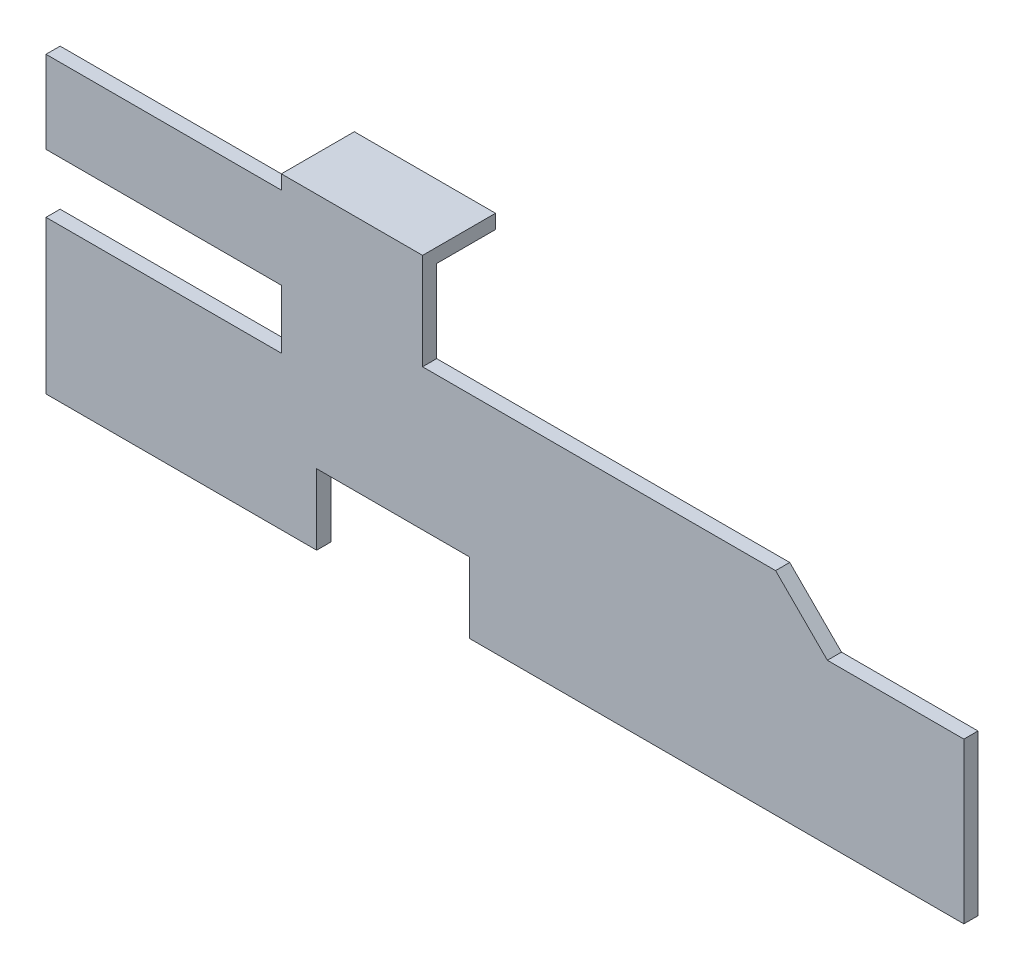
ISO-10303-21;
HEADER;
FILE_DESCRIPTION(('STEP AP214'),'2;1');
FILE_NAME('part.step','',(''),(''),'','','');
FILE_SCHEMA(('AUTOMOTIVE_DESIGN { 1 0 10303 214 1 1 1 1 }'));
ENDSEC;
DATA;
#1=APPLICATION_CONTEXT('core data for automotive mechanical design processes');
#2=APPLICATION_PROTOCOL_DEFINITION('international standard','automotive_design',2000,#1);
#3=PRODUCT_CONTEXT('',#1,'mechanical');
#4=PRODUCT('Part','Part','',(#3));
#5=PRODUCT_RELATED_PRODUCT_CATEGORY('part','',(#4));
#6=PRODUCT_DEFINITION_FORMATION('','',#4);
#7=PRODUCT_DEFINITION_CONTEXT('part definition',#1,'design');
#8=PRODUCT_DEFINITION('design','',#6,#7);
#9=PRODUCT_DEFINITION_SHAPE('','',#8);
#10=(LENGTH_UNIT() NAMED_UNIT(*) SI_UNIT(.MILLI.,.METRE.));
#11=(NAMED_UNIT(*) PLANE_ANGLE_UNIT() SI_UNIT($,.RADIAN.));
#12=(NAMED_UNIT(*) SI_UNIT($,.STERADIAN.) SOLID_ANGLE_UNIT());
#13=UNCERTAINTY_MEASURE_WITH_UNIT(LENGTH_MEASURE(1.E-05),#10,'distance_accuracy_value','');
#14=(GEOMETRIC_REPRESENTATION_CONTEXT(3) GLOBAL_UNCERTAINTY_ASSIGNED_CONTEXT((#13)) GLOBAL_UNIT_ASSIGNED_CONTEXT((#10,
#11,#12)) REPRESENTATION_CONTEXT('',''));
#15=CARTESIAN_POINT('',(0.,0.,0.));
#16=DIRECTION('',(0.,0.,1.));
#17=DIRECTION('',(1.,0.,0.));
#18=AXIS2_PLACEMENT_3D('',#15,#16,#17);
#19=CARTESIAN_POINT('',(0.,0.,0.));
#20=DIRECTION('',(0.,0.,1.));
#21=DIRECTION('',(1.,0.,0.));
#22=AXIS2_PLACEMENT_3D('',#19,#20,#21);
#23=PLANE('',#22);
#24=DIRECTION('',(-1.,0.,0.));
#25=VECTOR('',#24,1.);
#26=CARTESIAN_POINT('',(10.,12.5,0.));
#27=LINE('',#26,#25);
#28=CARTESIAN_POINT('',(16.,12.5,0.));
#29=VERTEX_POINT('',#28);
#30=CARTESIAN_POINT('',(10.,12.5,0.));
#31=VERTEX_POINT('',#30);
#32=EDGE_CURVE('E52',#29,#31,#27,.T.);
#33=ORIENTED_EDGE('',*,*,#32,.F.);
#34=DIRECTION('',(0.,1.,0.));
#35=VECTOR('',#34,1.);
#36=CARTESIAN_POINT('',(16.,8.99999999999999,0.));
#37=LINE('',#36,#35);
#38=CARTESIAN_POINT('',(16.,8.99999999999999,0.));
#39=VERTEX_POINT('',#38);
#40=EDGE_CURVE('E216',#39,#29,#37,.T.);
#41=ORIENTED_EDGE('',*,*,#40,.F.);
#42=DIRECTION('',(-1.,0.,0.));
#43=VECTOR('',#42,1.);
#44=CARTESIAN_POINT('',(31.,9.,0.));
#45=LINE('',#44,#43);
#46=CARTESIAN_POINT('',(31.,9.,0.));
#47=VERTEX_POINT('',#46);
#48=EDGE_CURVE('E214',#47,#39,#45,.T.);
#49=ORIENTED_EDGE('',*,*,#48,.F.);
#50=DIRECTION('',(-0.707106781186548,0.707106781186547,0.));
#51=VECTOR('',#50,1.);
#52=CARTESIAN_POINT('',(33.2,6.8,0.));
#53=LINE('',#52,#51);
#54=CARTESIAN_POINT('',(33.2,6.8,0.));
#55=VERTEX_POINT('',#54);
#56=EDGE_CURVE('E212',#55,#47,#53,.T.);
#57=ORIENTED_EDGE('',*,*,#56,.F.);
#58=DIRECTION('',(-1.,0.,0.));
#59=VECTOR('',#58,1.);
#60=CARTESIAN_POINT('',(39.,6.8,0.));
#61=LINE('',#60,#59);
#62=CARTESIAN_POINT('',(39.,6.8,0.));
#63=VERTEX_POINT('',#62);
#64=EDGE_CURVE('E210',#63,#55,#61,.T.);
#65=ORIENTED_EDGE('',*,*,#64,.F.);
#66=DIRECTION('',(0.,1.,0.));
#67=VECTOR('',#66,1.);
#68=CARTESIAN_POINT('',(39.,0.,0.));
#69=LINE('',#68,#67);
#70=CARTESIAN_POINT('',(39.,0.,0.));
#71=VERTEX_POINT('',#70);
#72=EDGE_CURVE('E208',#71,#63,#69,.T.);
#73=ORIENTED_EDGE('',*,*,#72,.F.);
#74=DIRECTION('',(1.,0.,0.));
#75=VECTOR('',#74,1.);
#76=CARTESIAN_POINT('',(18.,0.,0.));
#77=LINE('',#76,#75);
#78=CARTESIAN_POINT('',(18.,0.,0.));
#79=VERTEX_POINT('',#78);
#80=EDGE_CURVE('E206',#79,#71,#77,.T.);
#81=ORIENTED_EDGE('',*,*,#80,.F.);
#82=DIRECTION('',(0.,-1.,0.));
#83=VECTOR('',#82,1.);
#84=CARTESIAN_POINT('',(18.,3.,0.));
#85=LINE('',#84,#83);
#86=CARTESIAN_POINT('',(18.,3.,0.));
#87=VERTEX_POINT('',#86);
#88=EDGE_CURVE('E204',#87,#79,#85,.T.);
#89=ORIENTED_EDGE('',*,*,#88,.F.);
#90=DIRECTION('',(1.,0.,0.));
#91=VECTOR('',#90,1.);
#92=CARTESIAN_POINT('',(11.5,3.,0.));
#93=LINE('',#92,#91);
#94=CARTESIAN_POINT('',(11.5,3.,0.));
#95=VERTEX_POINT('',#94);
#96=EDGE_CURVE('E202',#95,#87,#93,.T.);
#97=ORIENTED_EDGE('',*,*,#96,.F.);
#98=DIRECTION('',(0.,1.,0.));
#99=VECTOR('',#98,1.);
#100=CARTESIAN_POINT('',(11.5,0.,0.));
#101=LINE('',#100,#99);
#102=CARTESIAN_POINT('',(11.5,0.,0.));
#103=VERTEX_POINT('',#102);
#104=EDGE_CURVE('E200',#103,#95,#101,.T.);
#105=ORIENTED_EDGE('',*,*,#104,.F.);
#106=DIRECTION('',(1.,0.,0.));
#107=VECTOR('',#106,1.);
#108=CARTESIAN_POINT('',(0.,0.,0.));
#109=LINE('',#108,#107);
#110=CARTESIAN_POINT('',(0.,0.,0.));
#111=VERTEX_POINT('',#110);
#112=EDGE_CURVE('E197',#111,#103,#109,.T.);
#113=ORIENTED_EDGE('',*,*,#112,.F.);
#114=DIRECTION('',(0.,-1.,0.));
#115=VECTOR('',#114,1.);
#116=CARTESIAN_POINT('',(0.,6.5,0.));
#117=LINE('',#116,#115);
#118=CARTESIAN_POINT('',(0.,6.5,0.));
#119=VERTEX_POINT('',#118);
#120=EDGE_CURVE('E194',#119,#111,#117,.T.);
#121=ORIENTED_EDGE('',*,*,#120,.F.);
#122=DIRECTION('',(-1.,0.,0.));
#123=VECTOR('',#122,1.);
#124=CARTESIAN_POINT('',(10.,6.5,0.));
#125=LINE('',#124,#123);
#126=CARTESIAN_POINT('',(10.,6.5,0.));
#127=VERTEX_POINT('',#126);
#128=EDGE_CURVE('E118',#127,#119,#125,.T.);
#129=ORIENTED_EDGE('',*,*,#128,.F.);
#130=DIRECTION('',(0.,-1.,0.));
#131=VECTOR('',#130,1.);
#132=CARTESIAN_POINT('',(10.,9.,0.));
#133=LINE('',#132,#131);
#134=CARTESIAN_POINT('',(10.,9.,0.));
#135=VERTEX_POINT('',#134);
#136=EDGE_CURVE('E580',#135,#127,#133,.T.);
#137=ORIENTED_EDGE('',*,*,#136,.F.);
#138=DIRECTION('',(1.,0.,0.));
#139=VECTOR('',#138,1.);
#140=CARTESIAN_POINT('',(0.,9.,0.));
#141=LINE('',#140,#139);
#142=CARTESIAN_POINT('',(0.,9.,0.));
#143=VERTEX_POINT('',#142);
#144=EDGE_CURVE('E182',#143,#135,#141,.T.);
#145=ORIENTED_EDGE('',*,*,#144,.F.);
#146=DIRECTION('',(0.,-1.,0.));
#147=VECTOR('',#146,1.);
#148=CARTESIAN_POINT('',(0.,12.5,0.));
#149=LINE('',#148,#147);
#150=CARTESIAN_POINT('',(0.,12.5,0.));
#151=VERTEX_POINT('',#150);
#152=EDGE_CURVE('E292',#151,#143,#149,.T.);
#153=ORIENTED_EDGE('',*,*,#152,.F.);
#154=DIRECTION('',(-1.,0.,0.));
#155=VECTOR('',#154,1.);
#156=CARTESIAN_POINT('',(10.,12.5,0.));
#157=LINE('',#156,#155);
#158=EDGE_CURVE('E219',#31,#151,#157,.T.);
#159=ORIENTED_EDGE('',*,*,#158,.F.);
#160=EDGE_LOOP('',(#33,#41,#49,#57,#65,#73,#81,#89,#97,#105,#113,#121,#129,#137,#145,#153,#159));
#161=FACE_BOUND('',#160,.T.);
#162=ADVANCED_FACE('F35',(#161),#23,.F.);
#163=CARTESIAN_POINT('',(0.,6.5,0.6));
#164=DIRECTION('',(1.,0.,0.));
#165=DIRECTION('',(0.,1.,0.));
#166=AXIS2_PLACEMENT_3D('',#163,#164,#165);
#167=PLANE('',#166);
#168=ORIENTED_EDGE('',*,*,#120,.T.);
#169=DIRECTION('',(0.,0.,-1.));
#170=VECTOR('',#169,1.);
#171=CARTESIAN_POINT('',(0.,0.,0.6));
#172=LINE('',#171,#170);
#173=CARTESIAN_POINT('',(0.,0.,0.6));
#174=VERTEX_POINT('',#173);
#175=EDGE_CURVE('E11',#174,#111,#172,.T.);
#176=ORIENTED_EDGE('',*,*,#175,.F.);
#177=DIRECTION('',(0.,-1.,0.));
#178=VECTOR('',#177,1.);
#179=CARTESIAN_POINT('',(0.,6.5,0.6));
#180=LINE('',#179,#178);
#181=CARTESIAN_POINT('',(0.,6.5,0.6));
#182=VERTEX_POINT('',#181);
#183=EDGE_CURVE('E255',#182,#174,#180,.T.);
#184=ORIENTED_EDGE('',*,*,#183,.F.);
#185=DIRECTION('',(0.,0.,-1.));
#186=VECTOR('',#185,1.);
#187=CARTESIAN_POINT('',(0.,6.5,0.6));
#188=LINE('',#187,#186);
#189=EDGE_CURVE('E190',#182,#119,#188,.T.);
#190=ORIENTED_EDGE('',*,*,#189,.T.);
#191=EDGE_LOOP('',(#168,#176,#184,#190));
#192=FACE_BOUND('',#191,.T.);
#193=ADVANCED_FACE('F37',(#192),#167,.F.);
#194=CARTESIAN_POINT('',(0.,0.,0.6));
#195=DIRECTION('',(0.,1.,0.));
#196=DIRECTION('',(0.,0.,1.));
#197=AXIS2_PLACEMENT_3D('',#194,#195,#196);
#198=PLANE('',#197);
#199=ORIENTED_EDGE('',*,*,#112,.T.);
#200=DIRECTION('',(0.,0.,-1.));
#201=VECTOR('',#200,1.);
#202=CARTESIAN_POINT('',(11.5,0.,0.6));
#203=LINE('',#202,#201);
#204=CARTESIAN_POINT('',(11.5,0.,0.6));
#205=VERTEX_POINT('',#204);
#206=EDGE_CURVE('E44',#205,#103,#203,.T.);
#207=ORIENTED_EDGE('',*,*,#206,.F.);
#208=DIRECTION('',(1.,0.,0.));
#209=VECTOR('',#208,1.);
#210=CARTESIAN_POINT('',(0.,0.,0.6));
#211=LINE('',#210,#209);
#212=EDGE_CURVE('E126',#174,#205,#211,.T.);
#213=ORIENTED_EDGE('',*,*,#212,.F.);
#214=ORIENTED_EDGE('',*,*,#175,.T.);
#215=EDGE_LOOP('',(#199,#207,#213,#214));
#216=FACE_BOUND('',#215,.T.);
#217=ADVANCED_FACE('F343',(#216),#198,.F.);
#218=CARTESIAN_POINT('',(11.5,0.,0.6));
#219=DIRECTION('',(-1.,0.,0.));
#220=DIRECTION('',(0.,0.,1.));
#221=AXIS2_PLACEMENT_3D('',#218,#219,#220);
#222=PLANE('',#221);
#223=ORIENTED_EDGE('',*,*,#104,.T.);
#224=DIRECTION('',(0.,0.,-1.));
#225=VECTOR('',#224,1.);
#226=CARTESIAN_POINT('',(11.5,3.,0.6));
#227=LINE('',#226,#225);
#228=CARTESIAN_POINT('',(11.5,3.,0.6));
#229=VERTEX_POINT('',#228);
#230=EDGE_CURVE('E318',#229,#95,#227,.T.);
#231=ORIENTED_EDGE('',*,*,#230,.F.);
#232=DIRECTION('',(0.,1.,0.));
#233=VECTOR('',#232,1.);
#234=CARTESIAN_POINT('',(11.5,0.,0.6));
#235=LINE('',#234,#233);
#236=EDGE_CURVE('E258',#205,#229,#235,.T.);
#237=ORIENTED_EDGE('',*,*,#236,.F.);
#238=ORIENTED_EDGE('',*,*,#206,.T.);
#239=EDGE_LOOP('',(#223,#231,#237,#238));
#240=FACE_BOUND('',#239,.T.);
#241=ADVANCED_FACE('F324',(#240),#222,.F.);
#242=CARTESIAN_POINT('',(11.5,3.,0.6));
#243=DIRECTION('',(0.,1.,0.));
#244=DIRECTION('',(0.,0.,1.));
#245=AXIS2_PLACEMENT_3D('',#242,#243,#244);
#246=PLANE('',#245);
#247=ORIENTED_EDGE('',*,*,#96,.T.);
#248=DIRECTION('',(0.,0.,-1.));
#249=VECTOR('',#248,1.);
#250=CARTESIAN_POINT('',(18.,3.,0.6));
#251=LINE('',#250,#249);
#252=CARTESIAN_POINT('',(18.,3.,0.6));
#253=VERTEX_POINT('',#252);
#254=EDGE_CURVE('E315',#253,#87,#251,.T.);
#255=ORIENTED_EDGE('',*,*,#254,.F.);
#256=DIRECTION('',(1.,0.,0.));
#257=VECTOR('',#256,1.);
#258=CARTESIAN_POINT('',(11.5,3.,0.6));
#259=LINE('',#258,#257);
#260=EDGE_CURVE('E260',#229,#253,#259,.T.);
#261=ORIENTED_EDGE('',*,*,#260,.F.);
#262=ORIENTED_EDGE('',*,*,#230,.T.);
#263=EDGE_LOOP('',(#247,#255,#261,#262));
#264=FACE_BOUND('',#263,.T.);
#265=ADVANCED_FACE('F332',(#264),#246,.F.);
#266=CARTESIAN_POINT('',(18.,3.,0.6));
#267=DIRECTION('',(1.,0.,0.));
#268=DIRECTION('',(0.,0.,-1.));
#269=AXIS2_PLACEMENT_3D('',#266,#267,#268);
#270=PLANE('',#269);
#271=ORIENTED_EDGE('',*,*,#88,.T.);
#272=DIRECTION('',(0.,0.,-1.));
#273=VECTOR('',#272,1.);
#274=CARTESIAN_POINT('',(18.,0.,0.6));
#275=LINE('',#274,#273);
#276=CARTESIAN_POINT('',(18.,0.,0.6));
#277=VERTEX_POINT('',#276);
#278=EDGE_CURVE('E312',#277,#79,#275,.T.);
#279=ORIENTED_EDGE('',*,*,#278,.F.);
#280=DIRECTION('',(0.,-1.,0.));
#281=VECTOR('',#280,1.);
#282=CARTESIAN_POINT('',(18.,3.,0.6));
#283=LINE('',#282,#281);
#284=EDGE_CURVE('E262',#253,#277,#283,.T.);
#285=ORIENTED_EDGE('',*,*,#284,.F.);
#286=ORIENTED_EDGE('',*,*,#254,.T.);
#287=EDGE_LOOP('',(#271,#279,#285,#286));
#288=FACE_BOUND('',#287,.T.);
#289=ADVANCED_FACE('F336',(#288),#270,.F.);
#290=CARTESIAN_POINT('',(18.,0.,0.6));
#291=DIRECTION('',(0.,1.,0.));
#292=DIRECTION('',(0.,0.,1.));
#293=AXIS2_PLACEMENT_3D('',#290,#291,#292);
#294=PLANE('',#293);
#295=ORIENTED_EDGE('',*,*,#80,.T.);
#296=DIRECTION('',(0.,0.,-1.));
#297=VECTOR('',#296,1.);
#298=CARTESIAN_POINT('',(39.,0.,0.6));
#299=LINE('',#298,#297);
#300=CARTESIAN_POINT('',(39.,0.,0.6));
#301=VERTEX_POINT('',#300);
#302=EDGE_CURVE('E309',#301,#71,#299,.T.);
#303=ORIENTED_EDGE('',*,*,#302,.F.);
#304=DIRECTION('',(1.,0.,0.));
#305=VECTOR('',#304,1.);
#306=CARTESIAN_POINT('',(18.,0.,0.6));
#307=LINE('',#306,#305);
#308=EDGE_CURVE('E264',#277,#301,#307,.T.);
#309=ORIENTED_EDGE('',*,*,#308,.F.);
#310=ORIENTED_EDGE('',*,*,#278,.T.);
#311=EDGE_LOOP('',(#295,#303,#309,#310));
#312=FACE_BOUND('',#311,.T.);
#313=ADVANCED_FACE('F390',(#312),#294,.F.);
#314=CARTESIAN_POINT('',(39.,0.,0.6));
#315=DIRECTION('',(-1.,0.,0.));
#316=DIRECTION('',(0.,-1.,0.));
#317=AXIS2_PLACEMENT_3D('',#314,#315,#316);
#318=PLANE('',#317);
#319=ORIENTED_EDGE('',*,*,#72,.T.);
#320=DIRECTION('',(0.,0.,-1.));
#321=VECTOR('',#320,1.);
#322=CARTESIAN_POINT('',(39.,6.8,0.6));
#323=LINE('',#322,#321);
#324=CARTESIAN_POINT('',(39.,6.8,0.6));
#325=VERTEX_POINT('',#324);
#326=EDGE_CURVE('E306',#325,#63,#323,.T.);
#327=ORIENTED_EDGE('',*,*,#326,.F.);
#328=DIRECTION('',(0.,1.,0.));
#329=VECTOR('',#328,1.);
#330=CARTESIAN_POINT('',(39.,0.,0.6));
#331=LINE('',#330,#329);
#332=EDGE_CURVE('E266',#301,#325,#331,.T.);
#333=ORIENTED_EDGE('',*,*,#332,.F.);
#334=ORIENTED_EDGE('',*,*,#302,.T.);
#335=EDGE_LOOP('',(#319,#327,#333,#334));
#336=FACE_BOUND('',#335,.T.);
#337=ADVANCED_FACE('F386',(#336),#318,.F.);
#338=CARTESIAN_POINT('',(39.,6.8,0.6));
#339=DIRECTION('',(0.,-1.,0.));
#340=DIRECTION('',(1.,0.,0.));
#341=AXIS2_PLACEMENT_3D('',#338,#339,#340);
#342=PLANE('',#341);
#343=ORIENTED_EDGE('',*,*,#64,.T.);
#344=DIRECTION('',(0.,0.,-1.));
#345=VECTOR('',#344,1.);
#346=CARTESIAN_POINT('',(33.2,6.8,0.6));
#347=LINE('',#346,#345);
#348=CARTESIAN_POINT('',(33.2,6.8,0.6));
#349=VERTEX_POINT('',#348);
#350=EDGE_CURVE('E303',#349,#55,#347,.T.);
#351=ORIENTED_EDGE('',*,*,#350,.F.);
#352=DIRECTION('',(-1.,0.,0.));
#353=VECTOR('',#352,1.);
#354=CARTESIAN_POINT('',(39.,6.8,0.6));
#355=LINE('',#354,#353);
#356=EDGE_CURVE('E268',#325,#349,#355,.T.);
#357=ORIENTED_EDGE('',*,*,#356,.F.);
#358=ORIENTED_EDGE('',*,*,#326,.T.);
#359=EDGE_LOOP('',(#343,#351,#357,#358));
#360=FACE_BOUND('',#359,.T.);
#361=ADVANCED_FACE('F382',(#360),#342,.F.);
#362=CARTESIAN_POINT('',(33.2,6.8,0.6));
#363=DIRECTION('',(-0.707106781186547,-0.707106781186548,0.));
#364=DIRECTION('',(0.707106781186548,-0.707106781186547,0.));
#365=AXIS2_PLACEMENT_3D('',#362,#363,#364);
#366=PLANE('',#365);
#367=ORIENTED_EDGE('',*,*,#56,.T.);
#368=DIRECTION('',(0.,0.,-1.));
#369=VECTOR('',#368,1.);
#370=CARTESIAN_POINT('',(31.,9.,0.6));
#371=LINE('',#370,#369);
#372=CARTESIAN_POINT('',(31.,9.,0.6));
#373=VERTEX_POINT('',#372);
#374=EDGE_CURVE('E300',#373,#47,#371,.T.);
#375=ORIENTED_EDGE('',*,*,#374,.F.);
#376=DIRECTION('',(-0.707106781186548,0.707106781186547,0.));
#377=VECTOR('',#376,1.);
#378=CARTESIAN_POINT('',(33.2,6.8,0.6));
#379=LINE('',#378,#377);
#380=EDGE_CURVE('E270',#349,#373,#379,.T.);
#381=ORIENTED_EDGE('',*,*,#380,.F.);
#382=ORIENTED_EDGE('',*,*,#350,.T.);
#383=EDGE_LOOP('',(#367,#375,#381,#382));
#384=FACE_BOUND('',#383,.T.);
#385=ADVANCED_FACE('F378',(#384),#366,.F.);
#386=CARTESIAN_POINT('',(31.,9.,0.6));
#387=DIRECTION('',(0.,-1.,0.));
#388=DIRECTION('',(1.,0.,0.));
#389=AXIS2_PLACEMENT_3D('',#386,#387,#388);
#390=PLANE('',#389);
#391=ORIENTED_EDGE('',*,*,#48,.T.);
#392=DIRECTION('',(0.,0.,-1.));
#393=VECTOR('',#392,1.);
#394=CARTESIAN_POINT('',(16.,8.99999999999999,0.6));
#395=LINE('',#394,#393);
#396=CARTESIAN_POINT('',(16.,8.99999999999999,0.6));
#397=VERTEX_POINT('',#396);
#398=EDGE_CURVE('E297',#397,#39,#395,.T.);
#399=ORIENTED_EDGE('',*,*,#398,.F.);
#400=DIRECTION('',(-1.,0.,0.));
#401=VECTOR('',#400,1.);
#402=CARTESIAN_POINT('',(31.,9.,0.6));
#403=LINE('',#402,#401);
#404=EDGE_CURVE('E272',#373,#397,#403,.T.);
#405=ORIENTED_EDGE('',*,*,#404,.F.);
#406=ORIENTED_EDGE('',*,*,#374,.T.);
#407=EDGE_LOOP('',(#391,#399,#405,#406));
#408=FACE_BOUND('',#407,.T.);
#409=ADVANCED_FACE('F374',(#408),#390,.F.);
#410=CARTESIAN_POINT('',(16.,8.99999999999999,0.6));
#411=DIRECTION('',(-1.,0.,0.));
#412=DIRECTION('',(0.,0.,1.));
#413=AXIS2_PLACEMENT_3D('',#410,#411,#412);
#414=PLANE('',#413);
#415=DIRECTION('',(0.,0.,1.));
#416=VECTOR('',#415,1.);
#417=CARTESIAN_POINT('',(16.,13.1,-2.5));
#418=LINE('',#417,#416);
#419=CARTESIAN_POINT('',(16.,13.1,-2.5));
#420=VERTEX_POINT('',#419);
#421=CARTESIAN_POINT('',(16.,13.1,0.6));
#422=VERTEX_POINT('',#421);
#423=EDGE_CURVE('E224',#420,#422,#418,.T.);
#424=ORIENTED_EDGE('',*,*,#423,.T.);
#425=DIRECTION('',(0.,1.,0.));
#426=VECTOR('',#425,1.);
#427=CARTESIAN_POINT('',(16.,8.99999999999999,0.6));
#428=LINE('',#427,#426);
#429=EDGE_CURVE('E274',#397,#422,#428,.T.);
#430=ORIENTED_EDGE('',*,*,#429,.F.);
#431=ORIENTED_EDGE('',*,*,#398,.T.);
#432=ORIENTED_EDGE('',*,*,#40,.T.);
#433=DIRECTION('',(0.,0.,1.));
#434=VECTOR('',#433,1.);
#435=CARTESIAN_POINT('',(16.,12.5,-2.5));
#436=LINE('',#435,#434);
#437=CARTESIAN_POINT('',(16.,12.5,-2.5));
#438=VERTEX_POINT('',#437);
#439=EDGE_CURVE('E227',#438,#29,#436,.T.);
#440=ORIENTED_EDGE('',*,*,#439,.F.);
#441=DIRECTION('',(0.,-1.,0.));
#442=VECTOR('',#441,1.);
#443=CARTESIAN_POINT('',(16.,12.5,-2.5));
#444=LINE('',#443,#442);
#445=EDGE_CURVE('E251',#420,#438,#444,.T.);
#446=ORIENTED_EDGE('',*,*,#445,.F.);
#447=EDGE_LOOP('',(#424,#430,#431,#432,#440,#446));
#448=FACE_BOUND('',#447,.T.);
#449=ADVANCED_FACE('F371',(#448),#414,.F.);
#450=CARTESIAN_POINT('',(10.,15.,0.6));
#451=DIRECTION('',(1.,0.,0.));
#452=DIRECTION('',(0.,0.,-1.));
#453=AXIS2_PLACEMENT_3D('',#450,#451,#452);
#454=PLANE('',#453);
#455=DIRECTION('',(0.,-1.,0.));
#456=VECTOR('',#455,1.);
#457=CARTESIAN_POINT('',(10.,15.,0.6));
#458=LINE('',#457,#456);
#459=CARTESIAN_POINT('',(10.,13.1,0.6));
#460=VERTEX_POINT('',#459);
#461=CARTESIAN_POINT('',(10.,12.5,0.6));
#462=VERTEX_POINT('',#461);
#463=EDGE_CURVE('E277',#460,#462,#458,.T.);
#464=ORIENTED_EDGE('',*,*,#463,.F.);
#465=DIRECTION('',(0.,0.,1.));
#466=VECTOR('',#465,1.);
#467=CARTESIAN_POINT('',(10.,13.1,-2.5));
#468=LINE('',#467,#466);
#469=CARTESIAN_POINT('',(10.,13.1,-2.5));
#470=VERTEX_POINT('',#469);
#471=EDGE_CURVE('E198',#470,#460,#468,.T.);
#472=ORIENTED_EDGE('',*,*,#471,.F.);
#473=DIRECTION('',(0.,1.,0.));
#474=VECTOR('',#473,1.);
#475=CARTESIAN_POINT('',(10.,12.5,-2.5));
#476=LINE('',#475,#474);
#477=CARTESIAN_POINT('',(10.,12.5,-2.5));
#478=VERTEX_POINT('',#477);
#479=EDGE_CURVE('E235',#478,#470,#476,.T.);
#480=ORIENTED_EDGE('',*,*,#479,.F.);
#481=DIRECTION('',(0.,0.,1.));
#482=VECTOR('',#481,1.);
#483=CARTESIAN_POINT('',(10.,12.5,-2.5));
#484=LINE('',#483,#482);
#485=EDGE_CURVE('E239',#478,#31,#484,.T.);
#486=ORIENTED_EDGE('',*,*,#485,.T.);
#487=DIRECTION('',(0.,0.,-1.));
#488=VECTOR('',#487,1.);
#489=CARTESIAN_POINT('',(10.,12.5,0.6));
#490=LINE('',#489,#488);
#491=EDGE_CURVE('E289',#462,#31,#490,.T.);
#492=ORIENTED_EDGE('',*,*,#491,.F.);
#493=EDGE_LOOP('',(#464,#472,#480,#486,#492));
#494=FACE_BOUND('',#493,.T.);
#495=ADVANCED_FACE('F368',(#494),#454,.F.);
#496=CARTESIAN_POINT('',(10.,12.5,0.6));
#497=DIRECTION('',(0.,-1.,0.));
#498=DIRECTION('',(1.,0.,0.));
#499=AXIS2_PLACEMENT_3D('',#496,#497,#498);
#500=PLANE('',#499);
#501=ORIENTED_EDGE('',*,*,#158,.T.);
#502=DIRECTION('',(0.,0.,-1.));
#503=VECTOR('',#502,1.);
#504=CARTESIAN_POINT('',(0.,12.5,0.6));
#505=LINE('',#504,#503);
#506=CARTESIAN_POINT('',(0.,12.5,0.6));
#507=VERTEX_POINT('',#506);
#508=EDGE_CURVE('E285',#507,#151,#505,.T.);
#509=ORIENTED_EDGE('',*,*,#508,.F.);
#510=DIRECTION('',(-1.,0.,0.));
#511=VECTOR('',#510,1.);
#512=CARTESIAN_POINT('',(10.,12.5,0.6));
#513=LINE('',#512,#511);
#514=EDGE_CURVE('E279',#462,#507,#513,.T.);
#515=ORIENTED_EDGE('',*,*,#514,.F.);
#516=ORIENTED_EDGE('',*,*,#491,.T.);
#517=EDGE_LOOP('',(#501,#509,#515,#516));
#518=FACE_BOUND('',#517,.T.);
#519=ADVANCED_FACE('F286',(#518),#500,.F.);
#520=CARTESIAN_POINT('',(0.,12.5,0.6));
#521=DIRECTION('',(1.,0.,0.));
#522=DIRECTION('',(0.,1.,0.));
#523=AXIS2_PLACEMENT_3D('',#520,#521,#522);
#524=PLANE('',#523);
#525=ORIENTED_EDGE('',*,*,#152,.T.);
#526=DIRECTION('',(0.,0.,-1.));
#527=VECTOR('',#526,1.);
#528=CARTESIAN_POINT('',(0.,9.,0.6));
#529=LINE('',#528,#527);
#530=CARTESIAN_POINT('',(0.,9.,0.6));
#531=VERTEX_POINT('',#530);
#532=EDGE_CURVE('E185',#531,#143,#529,.T.);
#533=ORIENTED_EDGE('',*,*,#532,.F.);
#534=DIRECTION('',(0.,-1.,0.));
#535=VECTOR('',#534,1.);
#536=CARTESIAN_POINT('',(0.,12.5,0.6));
#537=LINE('',#536,#535);
#538=EDGE_CURVE('E173',#507,#531,#537,.T.);
#539=ORIENTED_EDGE('',*,*,#538,.F.);
#540=ORIENTED_EDGE('',*,*,#508,.T.);
#541=EDGE_LOOP('',(#525,#533,#539,#540));
#542=FACE_BOUND('',#541,.T.);
#543=ADVANCED_FACE('F291',(#542),#524,.F.);
#544=CARTESIAN_POINT('',(0.,9.,0.6));
#545=DIRECTION('',(0.,1.,0.));
#546=DIRECTION('',(0.,0.,1.));
#547=AXIS2_PLACEMENT_3D('',#544,#545,#546);
#548=PLANE('',#547);
#549=ORIENTED_EDGE('',*,*,#144,.T.);
#550=DIRECTION('',(0.,0.,-1.));
#551=VECTOR('',#550,1.);
#552=CARTESIAN_POINT('',(10.,9.,0.6));
#553=LINE('',#552,#551);
#554=CARTESIAN_POINT('',(10.,9.,0.6));
#555=VERTEX_POINT('',#554);
#556=EDGE_CURVE('E179',#555,#135,#553,.T.);
#557=ORIENTED_EDGE('',*,*,#556,.F.);
#558=DIRECTION('',(1.,0.,0.));
#559=VECTOR('',#558,1.);
#560=CARTESIAN_POINT('',(0.,9.,0.6));
#561=LINE('',#560,#559);
#562=EDGE_CURVE('E165',#531,#555,#561,.T.);
#563=ORIENTED_EDGE('',*,*,#562,.F.);
#564=ORIENTED_EDGE('',*,*,#532,.T.);
#565=EDGE_LOOP('',(#549,#557,#563,#564));
#566=FACE_BOUND('',#565,.T.);
#567=ADVANCED_FACE('F180',(#566),#548,.F.);
#568=CARTESIAN_POINT('',(10.,9.,0.6));
#569=DIRECTION('',(1.,0.,0.));
#570=DIRECTION('',(0.,0.,-1.));
#571=AXIS2_PLACEMENT_3D('',#568,#569,#570);
#572=PLANE('',#571);
#573=ORIENTED_EDGE('',*,*,#136,.T.);
#574=DIRECTION('',(0.,0.,-1.));
#575=VECTOR('',#574,1.);
#576=CARTESIAN_POINT('',(10.,6.5,0.6));
#577=LINE('',#576,#575);
#578=CARTESIAN_POINT('',(10.,6.5,0.6));
#579=VERTEX_POINT('',#578);
#580=EDGE_CURVE('E186',#579,#127,#577,.T.);
#581=ORIENTED_EDGE('',*,*,#580,.F.);
#582=DIRECTION('',(0.,-1.,0.));
#583=VECTOR('',#582,1.);
#584=CARTESIAN_POINT('',(10.,9.,0.6));
#585=LINE('',#584,#583);
#586=EDGE_CURVE('E170',#555,#579,#585,.T.);
#587=ORIENTED_EDGE('',*,*,#586,.F.);
#588=ORIENTED_EDGE('',*,*,#556,.T.);
#589=EDGE_LOOP('',(#573,#581,#587,#588));
#590=FACE_BOUND('',#589,.T.);
#591=ADVANCED_FACE('F188',(#590),#572,.F.);
#592=CARTESIAN_POINT('',(10.,6.5,0.6));
#593=DIRECTION('',(0.,-1.,0.));
#594=DIRECTION('',(1.,0.,0.));
#595=AXIS2_PLACEMENT_3D('',#592,#593,#594);
#596=PLANE('',#595);
#597=ORIENTED_EDGE('',*,*,#128,.T.);
#598=ORIENTED_EDGE('',*,*,#189,.F.);
#599=DIRECTION('',(-1.,0.,0.));
#600=VECTOR('',#599,1.);
#601=CARTESIAN_POINT('',(10.,6.5,0.6));
#602=LINE('',#601,#600);
#603=EDGE_CURVE('E61',#579,#182,#602,.T.);
#604=ORIENTED_EDGE('',*,*,#603,.F.);
#605=ORIENTED_EDGE('',*,*,#580,.T.);
#606=EDGE_LOOP('',(#597,#598,#604,#605));
#607=FACE_BOUND('',#606,.T.);
#608=ADVANCED_FACE('F357',(#607),#596,.F.);
#609=CARTESIAN_POINT('',(0.,0.,0.6));
#610=DIRECTION('',(0.,0.,1.));
#611=DIRECTION('',(1.,0.,0.));
#612=AXIS2_PLACEMENT_3D('',#609,#610,#611);
#613=PLANE('',#612);
#614=DIRECTION('',(-1.,0.,0.));
#615=VECTOR('',#614,1.);
#616=CARTESIAN_POINT('',(16.,13.1,0.6));
#617=LINE('',#616,#615);
#618=EDGE_CURVE('E236',#422,#460,#617,.T.);
#619=ORIENTED_EDGE('',*,*,#618,.T.);
#620=ORIENTED_EDGE('',*,*,#463,.T.);
#621=ORIENTED_EDGE('',*,*,#514,.T.);
#622=ORIENTED_EDGE('',*,*,#538,.T.);
#623=ORIENTED_EDGE('',*,*,#562,.T.);
#624=ORIENTED_EDGE('',*,*,#586,.T.);
#625=ORIENTED_EDGE('',*,*,#603,.T.);
#626=ORIENTED_EDGE('',*,*,#183,.T.);
#627=ORIENTED_EDGE('',*,*,#212,.T.);
#628=ORIENTED_EDGE('',*,*,#236,.T.);
#629=ORIENTED_EDGE('',*,*,#260,.T.);
#630=ORIENTED_EDGE('',*,*,#284,.T.);
#631=ORIENTED_EDGE('',*,*,#308,.T.);
#632=ORIENTED_EDGE('',*,*,#332,.T.);
#633=ORIENTED_EDGE('',*,*,#356,.T.);
#634=ORIENTED_EDGE('',*,*,#380,.T.);
#635=ORIENTED_EDGE('',*,*,#404,.T.);
#636=ORIENTED_EDGE('',*,*,#429,.T.);
#637=EDGE_LOOP('',(#619,#620,#621,#622,#623,#624,#625,#626,#627,#628,#629,#630,#631,#632,#633,
#634,#635,#636));
#638=FACE_BOUND('',#637,.T.);
#639=ADVANCED_FACE('F168',(#638),#613,.T.);
#640=CARTESIAN_POINT('',(10.,13.1,-2.5));
#641=DIRECTION('',(0.,-1.,0.));
#642=DIRECTION('',(1.,0.,0.));
#643=AXIS2_PLACEMENT_3D('',#640,#641,#642);
#644=PLANE('',#643);
#645=ORIENTED_EDGE('',*,*,#471,.T.);
#646=ORIENTED_EDGE('',*,*,#618,.F.);
#647=ORIENTED_EDGE('',*,*,#423,.F.);
#648=DIRECTION('',(1.,0.,0.));
#649=VECTOR('',#648,1.);
#650=CARTESIAN_POINT('',(10.,13.1,-2.5));
#651=LINE('',#650,#649);
#652=EDGE_CURVE('E553',#470,#420,#651,.T.);
#653=ORIENTED_EDGE('',*,*,#652,.F.);
#654=EDGE_LOOP('',(#645,#646,#647,#653));
#655=FACE_BOUND('',#654,.T.);
#656=ADVANCED_FACE('F462',(#655),#644,.F.);
#657=CARTESIAN_POINT('',(10.,12.5,-2.5));
#658=DIRECTION('',(0.,1.,0.));
#659=DIRECTION('',(-1.,0.,0.));
#660=AXIS2_PLACEMENT_3D('',#657,#658,#659);
#661=PLANE('',#660);
#662=ORIENTED_EDGE('',*,*,#32,.T.);
#663=ORIENTED_EDGE('',*,*,#485,.F.);
#664=DIRECTION('',(-1.,0.,0.));
#665=VECTOR('',#664,1.);
#666=CARTESIAN_POINT('',(10.,12.5,-2.5));
#667=LINE('',#666,#665);
#668=EDGE_CURVE('E244',#438,#478,#667,.T.);
#669=ORIENTED_EDGE('',*,*,#668,.F.);
#670=ORIENTED_EDGE('',*,*,#439,.T.);
#671=EDGE_LOOP('',(#662,#663,#669,#670));
#672=FACE_BOUND('',#671,.T.);
#673=ADVANCED_FACE('F468',(#672),#661,.F.);
#674=CARTESIAN_POINT('',(0.,0.,-2.5));
#675=DIRECTION('',(0.,0.,-1.));
#676=DIRECTION('',(-1.,0.,0.));
#677=AXIS2_PLACEMENT_3D('',#674,#675,#676);
#678=PLANE('',#677);
#679=ORIENTED_EDGE('',*,*,#479,.T.);
#680=ORIENTED_EDGE('',*,*,#652,.T.);
#681=ORIENTED_EDGE('',*,*,#445,.T.);
#682=ORIENTED_EDGE('',*,*,#668,.T.);
#683=EDGE_LOOP('',(#679,#680,#681,#682));
#684=FACE_BOUND('',#683,.T.);
#685=ADVANCED_FACE('F474',(#684),#678,.T.);
#686=CLOSED_SHELL('',(#162,#193,#217,#241,#265,#289,#313,#337,#361,#385,#409,#449,#495,#519,
#543,#567,#591,#608,#639,#656,#673,#685));
#687=MANIFOLD_SOLID_BREP('B2',#686);
#688=ADVANCED_BREP_SHAPE_REPRESENTATION('',(#18,#687),#14);
#689=SHAPE_DEFINITION_REPRESENTATION(#9,#688);
ENDSEC;
END-ISO-10303-21;
